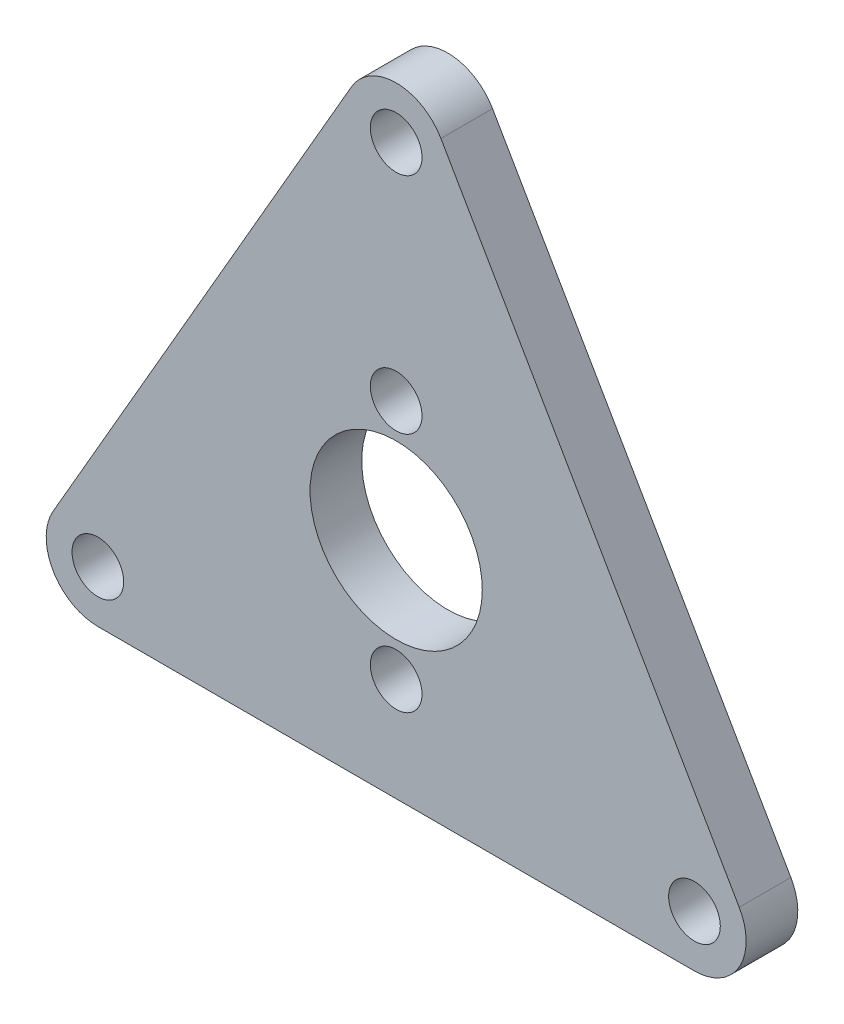
ISO-10303-21;
HEADER;
FILE_DESCRIPTION(('STEP AP214'),'2;1');
FILE_NAME('part.step','',(''),(''),'','','');
FILE_SCHEMA(('AUTOMOTIVE_DESIGN { 1 0 10303 214 1 1 1 1 }'));
ENDSEC;
DATA;
#1=APPLICATION_CONTEXT('core data for automotive mechanical design processes');
#2=APPLICATION_PROTOCOL_DEFINITION('international standard','automotive_design',2000,#1);
#3=PRODUCT_CONTEXT('',#1,'mechanical');
#4=PRODUCT('Part','Part','',(#3));
#5=PRODUCT_RELATED_PRODUCT_CATEGORY('part','',(#4));
#6=PRODUCT_DEFINITION_FORMATION('','',#4);
#7=PRODUCT_DEFINITION_CONTEXT('part definition',#1,'design');
#8=PRODUCT_DEFINITION('design','',#6,#7);
#9=PRODUCT_DEFINITION_SHAPE('','',#8);
#10=(LENGTH_UNIT() NAMED_UNIT(*) SI_UNIT(.MILLI.,.METRE.));
#11=(NAMED_UNIT(*) PLANE_ANGLE_UNIT() SI_UNIT($,.RADIAN.));
#12=(NAMED_UNIT(*) SI_UNIT($,.STERADIAN.) SOLID_ANGLE_UNIT());
#13=UNCERTAINTY_MEASURE_WITH_UNIT(LENGTH_MEASURE(1.E-05),#10,'distance_accuracy_value','');
#14=(GEOMETRIC_REPRESENTATION_CONTEXT(3) GLOBAL_UNCERTAINTY_ASSIGNED_CONTEXT((#13)) GLOBAL_UNIT_ASSIGNED_CONTEXT((#10,
#11,#12)) REPRESENTATION_CONTEXT('',''));
#15=CARTESIAN_POINT('',(0.,0.,0.));
#16=DIRECTION('',(0.,0.,1.));
#17=DIRECTION('',(1.,0.,0.));
#18=AXIS2_PLACEMENT_3D('',#15,#16,#17);
#19=CARTESIAN_POINT('',(-17.3205080756888,-9.99999999999999,3.));
#20=DIRECTION('',(0.,0.,1.));
#21=DIRECTION('',(1.,0.,0.));
#22=AXIS2_PLACEMENT_3D('',#19,#20,#21);
#23=PLANE('',#22);
#24=CARTESIAN_POINT('',(0.,7.,3.));
#25=DIRECTION('',(0.,0.,1.));
#26=DIRECTION('',(1.,0.,0.));
#27=AXIS2_PLACEMENT_3D('',#24,#25,#26);
#28=CIRCLE('',#27,1.5);
#29=CARTESIAN_POINT('',(1.5,7.,3.));
#30=VERTEX_POINT('',#29);
#31=EDGE_CURVE('E200',#30,#30,#28,.T.);
#32=ORIENTED_EDGE('',*,*,#31,.F.);
#33=EDGE_LOOP('',(#32));
#34=FACE_BOUND('',#33,.T.);
#35=CARTESIAN_POINT('',(17.3205080756888,-10.,3.));
#36=DIRECTION('',(0.,0.,1.));
#37=DIRECTION('',(1.,0.,0.));
#38=AXIS2_PLACEMENT_3D('',#35,#36,#37);
#39=CIRCLE('',#38,1.5);
#40=CARTESIAN_POINT('',(18.8205080756888,-10.,3.));
#41=VERTEX_POINT('',#40);
#42=EDGE_CURVE('E212',#41,#41,#39,.T.);
#43=ORIENTED_EDGE('',*,*,#42,.F.);
#44=EDGE_LOOP('',(#43));
#45=FACE_BOUND('',#44,.T.);
#46=CARTESIAN_POINT('',(-17.3205080756888,-10.,3.));
#47=DIRECTION('',(0.,0.,1.));
#48=DIRECTION('',(1.,0.,0.));
#49=AXIS2_PLACEMENT_3D('',#46,#47,#48);
#50=CIRCLE('',#49,1.5);
#51=CARTESIAN_POINT('',(-15.8205080756888,-10.,3.));
#52=VERTEX_POINT('',#51);
#53=EDGE_CURVE('E125',#52,#52,#50,.T.);
#54=ORIENTED_EDGE('',*,*,#53,.F.);
#55=EDGE_LOOP('',(#54));
#56=FACE_BOUND('',#55,.T.);
#57=CARTESIAN_POINT('',(-17.3205080756888,-9.99999999999999,3.));
#58=DIRECTION('',(0.,0.,1.));
#59=DIRECTION('',(1.,0.,0.));
#60=AXIS2_PLACEMENT_3D('',#57,#58,#59);
#61=CIRCLE('',#60,3.);
#62=CARTESIAN_POINT('',(-19.9185842870421,-8.49999999999999,3.));
#63=VERTEX_POINT('',#62);
#64=CARTESIAN_POINT('',(-17.3205080756888,-13.,3.));
#65=VERTEX_POINT('',#64);
#66=EDGE_CURVE('E132',#63,#65,#61,.T.);
#67=ORIENTED_EDGE('',*,*,#66,.T.);
#68=DIRECTION('',(1.,0.,0.));
#69=VECTOR('',#68,1.);
#70=CARTESIAN_POINT('',(-17.3205080756888,-13.,3.));
#71=LINE('',#70,#69);
#72=CARTESIAN_POINT('',(17.3205080756888,-13.,3.));
#73=VERTEX_POINT('',#72);
#74=EDGE_CURVE('E90',#65,#73,#71,.T.);
#75=ORIENTED_EDGE('',*,*,#74,.T.);
#76=CARTESIAN_POINT('',(17.3205080756888,-9.99999999999999,3.));
#77=DIRECTION('',(0.,0.,1.));
#78=DIRECTION('',(1.,0.,0.));
#79=AXIS2_PLACEMENT_3D('',#76,#77,#78);
#80=CIRCLE('',#79,3.);
#81=CARTESIAN_POINT('',(19.9185842870421,-8.49999999999999,3.));
#82=VERTEX_POINT('',#81);
#83=EDGE_CURVE('E103',#73,#82,#80,.T.);
#84=ORIENTED_EDGE('',*,*,#83,.T.);
#85=DIRECTION('',(-0.5,0.866025403784439,0.));
#86=VECTOR('',#85,1.);
#87=CARTESIAN_POINT('',(19.9185842870421,-8.49999999999999,3.));
#88=LINE('',#87,#86);
#89=CARTESIAN_POINT('',(2.59807621135331,21.5,3.));
#90=VERTEX_POINT('',#89);
#91=EDGE_CURVE('E97',#82,#90,#88,.T.);
#92=ORIENTED_EDGE('',*,*,#91,.T.);
#93=CARTESIAN_POINT('',(0.,20.,3.));
#94=DIRECTION('',(0.,0.,1.));
#95=DIRECTION('',(-1.,0.,0.));
#96=AXIS2_PLACEMENT_3D('',#93,#94,#95);
#97=CIRCLE('',#96,3.);
#98=CARTESIAN_POINT('',(-2.59807621135331,21.5,3.));
#99=VERTEX_POINT('',#98);
#100=EDGE_CURVE('E101',#90,#99,#97,.T.);
#101=ORIENTED_EDGE('',*,*,#100,.T.);
#102=DIRECTION('',(-0.5,-0.866025403784439,0.));
#103=VECTOR('',#102,1.);
#104=CARTESIAN_POINT('',(-2.59807621135331,21.5,3.));
#105=LINE('',#104,#103);
#106=EDGE_CURVE('E53',#99,#63,#105,.T.);
#107=ORIENTED_EDGE('',*,*,#106,.T.);
#108=EDGE_LOOP('',(#67,#75,#84,#92,#101,#107));
#109=FACE_BOUND('',#108,.T.);
#110=CARTESIAN_POINT('',(0.,20.,3.));
#111=DIRECTION('',(0.,0.,1.));
#112=DIRECTION('',(1.,0.,0.));
#113=AXIS2_PLACEMENT_3D('',#110,#111,#112);
#114=CIRCLE('',#113,1.5);
#115=CARTESIAN_POINT('',(1.5,20.,3.));
#116=VERTEX_POINT('',#115);
#117=EDGE_CURVE('E218',#116,#116,#114,.T.);
#118=ORIENTED_EDGE('',*,*,#117,.F.);
#119=EDGE_LOOP('',(#118));
#120=FACE_BOUND('',#119,.T.);
#121=CARTESIAN_POINT('',(0.,0.,3.));
#122=DIRECTION('',(0.,0.,1.));
#123=DIRECTION('',(1.,0.,0.));
#124=AXIS2_PLACEMENT_3D('',#121,#122,#123);
#125=CIRCLE('',#124,5.);
#126=CARTESIAN_POINT('',(5.,0.,3.));
#127=VERTEX_POINT('',#126);
#128=EDGE_CURVE('E206',#127,#127,#125,.T.);
#129=ORIENTED_EDGE('',*,*,#128,.F.);
#130=EDGE_LOOP('',(#129));
#131=FACE_BOUND('',#130,.T.);
#132=CARTESIAN_POINT('',(0.,-7.,3.));
#133=DIRECTION('',(0.,0.,1.));
#134=DIRECTION('',(1.,0.,0.));
#135=AXIS2_PLACEMENT_3D('',#132,#133,#134);
#136=CIRCLE('',#135,1.5);
#137=CARTESIAN_POINT('',(1.5,-7.,3.));
#138=VERTEX_POINT('',#137);
#139=EDGE_CURVE('E191',#138,#138,#136,.T.);
#140=ORIENTED_EDGE('',*,*,#139,.F.);
#141=EDGE_LOOP('',(#140));
#142=FACE_BOUND('',#141,.T.);
#143=ADVANCED_FACE('F36',(#34,#45,#56,#109,#120,#131,#142),#23,.T.);
#144=CARTESIAN_POINT('',(-17.3205080756888,-9.99999999999999,0.));
#145=DIRECTION('',(0.,0.,1.));
#146=DIRECTION('',(1.,0.,0.));
#147=AXIS2_PLACEMENT_3D('',#144,#145,#146);
#148=PLANE('',#147);
#149=CARTESIAN_POINT('',(-17.3205080756888,-9.99999999999999,0.));
#150=DIRECTION('',(0.,0.,1.));
#151=DIRECTION('',(1.,0.,0.));
#152=AXIS2_PLACEMENT_3D('',#149,#150,#151);
#153=CIRCLE('',#152,3.);
#154=CARTESIAN_POINT('',(-19.9185842870421,-8.49999999999999,0.));
#155=VERTEX_POINT('',#154);
#156=CARTESIAN_POINT('',(-17.3205080756888,-13.,0.));
#157=VERTEX_POINT('',#156);
#158=EDGE_CURVE('E121',#155,#157,#153,.T.);
#159=ORIENTED_EDGE('',*,*,#158,.F.);
#160=DIRECTION('',(-0.5,-0.866025403784439,0.));
#161=VECTOR('',#160,1.);
#162=CARTESIAN_POINT('',(-2.59807621135331,21.5,0.));
#163=LINE('',#162,#161);
#164=CARTESIAN_POINT('',(-2.59807621135331,21.5,0.));
#165=VERTEX_POINT('',#164);
#166=EDGE_CURVE('E82',#165,#155,#163,.T.);
#167=ORIENTED_EDGE('',*,*,#166,.F.);
#168=CARTESIAN_POINT('',(0.,20.,0.));
#169=DIRECTION('',(0.,0.,1.));
#170=DIRECTION('',(-1.,0.,0.));
#171=AXIS2_PLACEMENT_3D('',#168,#169,#170);
#172=CIRCLE('',#171,3.);
#173=CARTESIAN_POINT('',(2.59807621135331,21.5,0.));
#174=VERTEX_POINT('',#173);
#175=EDGE_CURVE('E76',#174,#165,#172,.T.);
#176=ORIENTED_EDGE('',*,*,#175,.F.);
#177=DIRECTION('',(-0.5,0.866025403784439,0.));
#178=VECTOR('',#177,1.);
#179=CARTESIAN_POINT('',(19.9185842870421,-8.49999999999999,0.));
#180=LINE('',#179,#178);
#181=CARTESIAN_POINT('',(19.9185842870421,-8.49999999999999,0.));
#182=VERTEX_POINT('',#181);
#183=EDGE_CURVE('E111',#182,#174,#180,.T.);
#184=ORIENTED_EDGE('',*,*,#183,.F.);
#185=CARTESIAN_POINT('',(17.3205080756888,-9.99999999999999,0.));
#186=DIRECTION('',(0.,0.,1.));
#187=DIRECTION('',(1.,0.,0.));
#188=AXIS2_PLACEMENT_3D('',#185,#186,#187);
#189=CIRCLE('',#188,3.);
#190=CARTESIAN_POINT('',(17.3205080756888,-13.,0.));
#191=VERTEX_POINT('',#190);
#192=EDGE_CURVE('E127',#191,#182,#189,.T.);
#193=ORIENTED_EDGE('',*,*,#192,.F.);
#194=DIRECTION('',(1.,0.,0.));
#195=VECTOR('',#194,1.);
#196=CARTESIAN_POINT('',(-17.3205080756888,-13.,0.));
#197=LINE('',#196,#195);
#198=EDGE_CURVE('E124',#157,#191,#197,.T.);
#199=ORIENTED_EDGE('',*,*,#198,.F.);
#200=EDGE_LOOP('',(#159,#167,#176,#184,#193,#199));
#201=FACE_BOUND('',#200,.T.);
#202=CARTESIAN_POINT('',(-17.3205080756888,-10.,0.));
#203=DIRECTION('',(0.,0.,1.));
#204=DIRECTION('',(1.,0.,0.));
#205=AXIS2_PLACEMENT_3D('',#202,#203,#204);
#206=CIRCLE('',#205,1.5);
#207=CARTESIAN_POINT('',(-15.8205080756888,-10.,0.));
#208=VERTEX_POINT('',#207);
#209=EDGE_CURVE('E221',#208,#208,#206,.T.);
#210=ORIENTED_EDGE('',*,*,#209,.T.);
#211=EDGE_LOOP('',(#210));
#212=FACE_BOUND('',#211,.T.);
#213=CARTESIAN_POINT('',(0.,20.,0.));
#214=DIRECTION('',(0.,0.,1.));
#215=DIRECTION('',(1.,0.,0.));
#216=AXIS2_PLACEMENT_3D('',#213,#214,#215);
#217=CIRCLE('',#216,1.5);
#218=CARTESIAN_POINT('',(1.5,20.,0.));
#219=VERTEX_POINT('',#218);
#220=EDGE_CURVE('E215',#219,#219,#217,.T.);
#221=ORIENTED_EDGE('',*,*,#220,.T.);
#222=EDGE_LOOP('',(#221));
#223=FACE_BOUND('',#222,.T.);
#224=CARTESIAN_POINT('',(17.3205080756888,-10.,0.));
#225=DIRECTION('',(0.,0.,1.));
#226=DIRECTION('',(1.,0.,0.));
#227=AXIS2_PLACEMENT_3D('',#224,#225,#226);
#228=CIRCLE('',#227,1.5);
#229=CARTESIAN_POINT('',(18.8205080756888,-10.,0.));
#230=VERTEX_POINT('',#229);
#231=EDGE_CURVE('E209',#230,#230,#228,.T.);
#232=ORIENTED_EDGE('',*,*,#231,.T.);
#233=EDGE_LOOP('',(#232));
#234=FACE_BOUND('',#233,.T.);
#235=CARTESIAN_POINT('',(0.,0.,0.));
#236=DIRECTION('',(0.,0.,1.));
#237=DIRECTION('',(1.,0.,0.));
#238=AXIS2_PLACEMENT_3D('',#235,#236,#237);
#239=CIRCLE('',#238,5.);
#240=CARTESIAN_POINT('',(5.,0.,0.));
#241=VERTEX_POINT('',#240);
#242=EDGE_CURVE('E203',#241,#241,#239,.T.);
#243=ORIENTED_EDGE('',*,*,#242,.T.);
#244=EDGE_LOOP('',(#243));
#245=FACE_BOUND('',#244,.T.);
#246=CARTESIAN_POINT('',(0.,7.,0.));
#247=DIRECTION('',(0.,0.,1.));
#248=DIRECTION('',(1.,0.,0.));
#249=AXIS2_PLACEMENT_3D('',#246,#247,#248);
#250=CIRCLE('',#249,1.5);
#251=CARTESIAN_POINT('',(1.5,7.,0.));
#252=VERTEX_POINT('',#251);
#253=EDGE_CURVE('E197',#252,#252,#250,.T.);
#254=ORIENTED_EDGE('',*,*,#253,.T.);
#255=EDGE_LOOP('',(#254));
#256=FACE_BOUND('',#255,.T.);
#257=CARTESIAN_POINT('',(0.,-7.,0.));
#258=DIRECTION('',(0.,0.,1.));
#259=DIRECTION('',(1.,0.,0.));
#260=AXIS2_PLACEMENT_3D('',#257,#258,#259);
#261=CIRCLE('',#260,1.5);
#262=CARTESIAN_POINT('',(1.5,-7.,0.));
#263=VERTEX_POINT('',#262);
#264=EDGE_CURVE('E194',#263,#263,#261,.T.);
#265=ORIENTED_EDGE('',*,*,#264,.T.);
#266=EDGE_LOOP('',(#265));
#267=FACE_BOUND('',#266,.T.);
#268=ADVANCED_FACE('F141',(#201,#212,#223,#234,#245,#256,#267),#148,.F.);
#269=CARTESIAN_POINT('',(-17.3205080756888,-9.99999999999999,3.));
#270=DIRECTION('',(0.,0.,-1.));
#271=DIRECTION('',(-1.,0.,0.));
#272=AXIS2_PLACEMENT_3D('',#269,#270,#271);
#273=CYLINDRICAL_SURFACE('',#272,3.);
#274=ORIENTED_EDGE('',*,*,#158,.T.);
#275=DIRECTION('',(0.,0.,-1.));
#276=VECTOR('',#275,1.);
#277=CARTESIAN_POINT('',(-17.3205080756888,-13.,3.));
#278=LINE('',#277,#276);
#279=EDGE_CURVE('E11',#65,#157,#278,.T.);
#280=ORIENTED_EDGE('',*,*,#279,.F.);
#281=ORIENTED_EDGE('',*,*,#66,.F.);
#282=DIRECTION('',(0.,0.,-1.));
#283=VECTOR('',#282,1.);
#284=CARTESIAN_POINT('',(-19.9185842870421,-8.49999999999999,3.));
#285=LINE('',#284,#283);
#286=EDGE_CURVE('E117',#63,#155,#285,.T.);
#287=ORIENTED_EDGE('',*,*,#286,.T.);
#288=EDGE_LOOP('',(#274,#280,#281,#287));
#289=FACE_BOUND('',#288,.T.);
#290=ADVANCED_FACE('F38',(#289),#273,.T.);
#291=CARTESIAN_POINT('',(-17.3205080756888,-13.,3.));
#292=DIRECTION('',(0.,1.,0.));
#293=DIRECTION('',(0.,0.,1.));
#294=AXIS2_PLACEMENT_3D('',#291,#292,#293);
#295=PLANE('',#294);
#296=ORIENTED_EDGE('',*,*,#198,.T.);
#297=DIRECTION('',(0.,0.,-1.));
#298=VECTOR('',#297,1.);
#299=CARTESIAN_POINT('',(17.3205080756888,-13.,3.));
#300=LINE('',#299,#298);
#301=EDGE_CURVE('E45',#73,#191,#300,.T.);
#302=ORIENTED_EDGE('',*,*,#301,.F.);
#303=ORIENTED_EDGE('',*,*,#74,.F.);
#304=ORIENTED_EDGE('',*,*,#279,.T.);
#305=EDGE_LOOP('',(#296,#302,#303,#304));
#306=FACE_BOUND('',#305,.T.);
#307=ADVANCED_FACE('F297',(#306),#295,.F.);
#308=CARTESIAN_POINT('',(17.3205080756888,-9.99999999999999,3.));
#309=DIRECTION('',(0.,0.,-1.));
#310=DIRECTION('',(-1.,0.,0.));
#311=AXIS2_PLACEMENT_3D('',#308,#309,#310);
#312=CYLINDRICAL_SURFACE('',#311,3.);
#313=ORIENTED_EDGE('',*,*,#192,.T.);
#314=DIRECTION('',(0.,0.,-1.));
#315=VECTOR('',#314,1.);
#316=CARTESIAN_POINT('',(19.9185842870421,-8.49999999999999,3.));
#317=LINE('',#316,#315);
#318=EDGE_CURVE('E112',#82,#182,#317,.T.);
#319=ORIENTED_EDGE('',*,*,#318,.F.);
#320=ORIENTED_EDGE('',*,*,#83,.F.);
#321=ORIENTED_EDGE('',*,*,#301,.T.);
#322=EDGE_LOOP('',(#313,#319,#320,#321));
#323=FACE_BOUND('',#322,.T.);
#324=ADVANCED_FACE('F138',(#323),#312,.T.);
#325=CARTESIAN_POINT('',(19.9185842870421,-8.49999999999999,3.));
#326=DIRECTION('',(-0.866025403784439,-0.5,0.));
#327=DIRECTION('',(0.5,-0.866025403784439,0.));
#328=AXIS2_PLACEMENT_3D('',#325,#326,#327);
#329=PLANE('',#328);
#330=ORIENTED_EDGE('',*,*,#183,.T.);
#331=DIRECTION('',(0.,0.,-1.));
#332=VECTOR('',#331,1.);
#333=CARTESIAN_POINT('',(2.59807621135331,21.5,3.));
#334=LINE('',#333,#332);
#335=EDGE_CURVE('E108',#90,#174,#334,.T.);
#336=ORIENTED_EDGE('',*,*,#335,.F.);
#337=ORIENTED_EDGE('',*,*,#91,.F.);
#338=ORIENTED_EDGE('',*,*,#318,.T.);
#339=EDGE_LOOP('',(#330,#336,#337,#338));
#340=FACE_BOUND('',#339,.T.);
#341=ADVANCED_FACE('F109',(#340),#329,.F.);
#342=CARTESIAN_POINT('',(0.,20.,3.));
#343=DIRECTION('',(0.,0.,-1.));
#344=DIRECTION('',(-1.,0.,0.));
#345=AXIS2_PLACEMENT_3D('',#342,#343,#344);
#346=CYLINDRICAL_SURFACE('',#345,3.);
#347=ORIENTED_EDGE('',*,*,#175,.T.);
#348=DIRECTION('',(0.,0.,-1.));
#349=VECTOR('',#348,1.);
#350=CARTESIAN_POINT('',(-2.59807621135331,21.5,3.));
#351=LINE('',#350,#349);
#352=EDGE_CURVE('E113',#99,#165,#351,.T.);
#353=ORIENTED_EDGE('',*,*,#352,.F.);
#354=ORIENTED_EDGE('',*,*,#100,.F.);
#355=ORIENTED_EDGE('',*,*,#335,.T.);
#356=EDGE_LOOP('',(#347,#353,#354,#355));
#357=FACE_BOUND('',#356,.T.);
#358=ADVANCED_FACE('F115',(#357),#346,.T.);
#359=CARTESIAN_POINT('',(-2.59807621135331,21.5,3.));
#360=DIRECTION('',(0.866025403784438,-0.5,0.));
#361=DIRECTION('',(0.5,0.866025403784439,0.));
#362=AXIS2_PLACEMENT_3D('',#359,#360,#361);
#363=PLANE('',#362);
#364=ORIENTED_EDGE('',*,*,#166,.T.);
#365=ORIENTED_EDGE('',*,*,#286,.F.);
#366=ORIENTED_EDGE('',*,*,#106,.F.);
#367=ORIENTED_EDGE('',*,*,#352,.T.);
#368=EDGE_LOOP('',(#364,#365,#366,#367));
#369=FACE_BOUND('',#368,.T.);
#370=ADVANCED_FACE('F146',(#369),#363,.F.);
#371=CARTESIAN_POINT('',(-17.3205080756888,-10.,3.));
#372=DIRECTION('',(0.,0.,-1.));
#373=DIRECTION('',(-1.,0.,0.));
#374=AXIS2_PLACEMENT_3D('',#371,#372,#373);
#375=CYLINDRICAL_SURFACE('',#374,1.5);
#376=ORIENTED_EDGE('',*,*,#53,.T.);
#377=EDGE_LOOP('',(#376));
#378=FACE_BOUND('',#377,.T.);
#379=ORIENTED_EDGE('',*,*,#209,.F.);
#380=EDGE_LOOP('',(#379));
#381=FACE_BOUND('',#380,.T.);
#382=ADVANCED_FACE('F148',(#378,#381),#375,.F.);
#383=CARTESIAN_POINT('',(0.,20.,3.));
#384=DIRECTION('',(0.,0.,-1.));
#385=DIRECTION('',(-1.,0.,0.));
#386=AXIS2_PLACEMENT_3D('',#383,#384,#385);
#387=CYLINDRICAL_SURFACE('',#386,1.5);
#388=ORIENTED_EDGE('',*,*,#117,.T.);
#389=EDGE_LOOP('',(#388));
#390=FACE_BOUND('',#389,.T.);
#391=ORIENTED_EDGE('',*,*,#220,.F.);
#392=EDGE_LOOP('',(#391));
#393=FACE_BOUND('',#392,.T.);
#394=ADVANCED_FACE('F154',(#390,#393),#387,.F.);
#395=CARTESIAN_POINT('',(17.3205080756888,-10.,3.));
#396=DIRECTION('',(0.,0.,-1.));
#397=DIRECTION('',(-1.,0.,0.));
#398=AXIS2_PLACEMENT_3D('',#395,#396,#397);
#399=CYLINDRICAL_SURFACE('',#398,1.5);
#400=ORIENTED_EDGE('',*,*,#42,.T.);
#401=EDGE_LOOP('',(#400));
#402=FACE_BOUND('',#401,.T.);
#403=ORIENTED_EDGE('',*,*,#231,.F.);
#404=EDGE_LOOP('',(#403));
#405=FACE_BOUND('',#404,.T.);
#406=ADVANCED_FACE('F170',(#402,#405),#399,.F.);
#407=CARTESIAN_POINT('',(0.,0.,3.));
#408=DIRECTION('',(0.,0.,-1.));
#409=DIRECTION('',(-1.,0.,0.));
#410=AXIS2_PLACEMENT_3D('',#407,#408,#409);
#411=CYLINDRICAL_SURFACE('',#410,5.);
#412=ORIENTED_EDGE('',*,*,#128,.T.);
#413=EDGE_LOOP('',(#412));
#414=FACE_BOUND('',#413,.T.);
#415=ORIENTED_EDGE('',*,*,#242,.F.);
#416=EDGE_LOOP('',(#415));
#417=FACE_BOUND('',#416,.T.);
#418=ADVANCED_FACE('F174',(#414,#417),#411,.F.);
#419=CARTESIAN_POINT('',(0.,7.,3.));
#420=DIRECTION('',(0.,0.,-1.));
#421=DIRECTION('',(-1.,0.,0.));
#422=AXIS2_PLACEMENT_3D('',#419,#420,#421);
#423=CYLINDRICAL_SURFACE('',#422,1.5);
#424=ORIENTED_EDGE('',*,*,#31,.T.);
#425=EDGE_LOOP('',(#424));
#426=FACE_BOUND('',#425,.T.);
#427=ORIENTED_EDGE('',*,*,#253,.F.);
#428=EDGE_LOOP('',(#427));
#429=FACE_BOUND('',#428,.T.);
#430=ADVANCED_FACE('F178',(#426,#429),#423,.F.);
#431=CARTESIAN_POINT('',(0.,-7.,3.));
#432=DIRECTION('',(0.,0.,-1.));
#433=DIRECTION('',(-1.,0.,0.));
#434=AXIS2_PLACEMENT_3D('',#431,#432,#433);
#435=CYLINDRICAL_SURFACE('',#434,1.5);
#436=ORIENTED_EDGE('',*,*,#139,.T.);
#437=EDGE_LOOP('',(#436));
#438=FACE_BOUND('',#437,.T.);
#439=ORIENTED_EDGE('',*,*,#264,.F.);
#440=EDGE_LOOP('',(#439));
#441=FACE_BOUND('',#440,.T.);
#442=ADVANCED_FACE('F182',(#438,#441),#435,.F.);
#443=CLOSED_SHELL('',(#143,#268,#290,#307,#324,#341,#358,#370,#382,#394,#406,#418,#430,#442));
#444=MANIFOLD_SOLID_BREP('B2',#443);
#445=ADVANCED_BREP_SHAPE_REPRESENTATION('',(#18,#444),#14);
#446=SHAPE_DEFINITION_REPRESENTATION(#9,#445);
ENDSEC;
END-ISO-10303-21;
